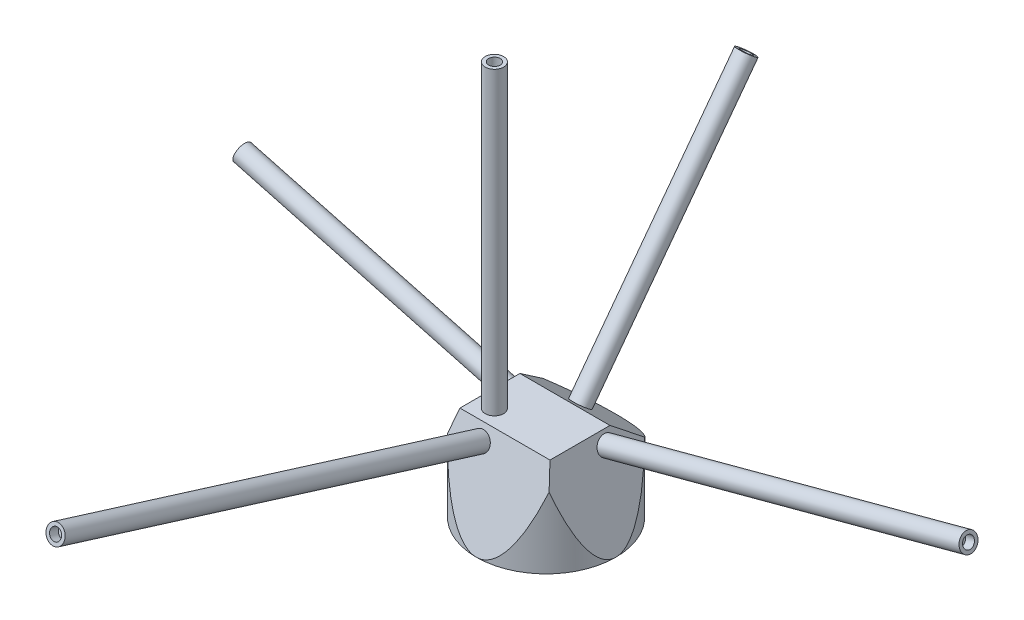
ISO-10303-21;
HEADER;
FILE_DESCRIPTION(('STEP AP214'),'2;1');
FILE_NAME('part.step','',(''),(''),'','','');
FILE_SCHEMA(('AUTOMOTIVE_DESIGN { 1 0 10303 214 1 1 1 1 }'));
ENDSEC;
DATA;
#1=APPLICATION_CONTEXT('core data for automotive mechanical design processes');
#2=APPLICATION_PROTOCOL_DEFINITION('international standard','automotive_design',2000,#1);
#3=PRODUCT_CONTEXT('',#1,'mechanical');
#4=PRODUCT('Part','Part','',(#3));
#5=PRODUCT_RELATED_PRODUCT_CATEGORY('part','',(#4));
#6=PRODUCT_DEFINITION_FORMATION('','',#4);
#7=PRODUCT_DEFINITION_CONTEXT('part definition',#1,'design');
#8=PRODUCT_DEFINITION('design','',#6,#7);
#9=PRODUCT_DEFINITION_SHAPE('','',#8);
#10=(LENGTH_UNIT() NAMED_UNIT(*) SI_UNIT(.MILLI.,.METRE.));
#11=(NAMED_UNIT(*) PLANE_ANGLE_UNIT() SI_UNIT($,.RADIAN.));
#12=(NAMED_UNIT(*) SI_UNIT($,.STERADIAN.) SOLID_ANGLE_UNIT());
#13=UNCERTAINTY_MEASURE_WITH_UNIT(LENGTH_MEASURE(1.E-05),#10,'distance_accuracy_value','');
#14=(GEOMETRIC_REPRESENTATION_CONTEXT(3) GLOBAL_UNCERTAINTY_ASSIGNED_CONTEXT((#13)) GLOBAL_UNIT_ASSIGNED_CONTEXT((#10,
#11,#12)) REPRESENTATION_CONTEXT('',''));
#15=CARTESIAN_POINT('',(0.,0.,0.));
#16=DIRECTION('',(0.,0.,1.));
#17=DIRECTION('',(1.,0.,0.));
#18=AXIS2_PLACEMENT_3D('',#15,#16,#17);
#19=CARTESIAN_POINT('',(-15.115,0.,-4.0745738296475));
#20=DIRECTION('',(0.,-0.800715242095726,0.599045157793286));
#21=DIRECTION('',(0.,-0.599045157793286,-0.800715242095726));
#22=AXIS2_PLACEMENT_3D('',#19,#20,#21);
#23=PLANE('',#22);
#24=CARTESIAN_POINT('',(0.,3.04834177545201,0.));
#25=DIRECTION('',(0.,-0.800715242095726,0.599045157793286));
#26=DIRECTION('',(0.,0.599045157793286,0.800715242095726));
#27=AXIS2_PLACEMENT_3D('',#24,#25,#26);
#28=ELLIPSE('',#27,18.8768730821699,15.115);
#29=CARTESIAN_POINT('',(11.010470804893,-4.69886600146518,-10.3553250868622));
#30=VERTEX_POINT('',#29);
#31=CARTESIAN_POINT('',(-11.010470804893,-4.69886600146518,-10.3553250868622));
#32=VERTEX_POINT('',#31);
#33=EDGE_CURVE('E170',#30,#32,#28,.F.);
#34=ORIENTED_EDGE('',*,*,#33,.T.);
#35=DIRECTION('',(0.158658439582921,0.591457370299799,0.790573006538396));
#36=VECTOR('',#35,1.);
#37=CARTESIAN_POINT('',(-9.88505046491901,-0.503450009017749,-4.74751157166802));
#38=LINE('',#37,#36);
#39=CARTESIAN_POINT('',(-9.75,0.,-4.0745738296475));
#40=VERTEX_POINT('',#39);
#41=EDGE_CURVE('E121',#32,#40,#38,.T.);
#42=ORIENTED_EDGE('',*,*,#41,.T.);
#43=DIRECTION('',(1.,0.,0.));
#44=VECTOR('',#43,1.);
#45=CARTESIAN_POINT('',(0.,0.,-4.0745738296475));
#46=LINE('',#45,#44);
#47=CARTESIAN_POINT('',(9.75,0.,-4.0745738296475));
#48=VERTEX_POINT('',#47);
#49=EDGE_CURVE('E101',#40,#48,#46,.T.);
#50=ORIENTED_EDGE('',*,*,#49,.T.);
#51=DIRECTION('',(0.158658439582921,-0.591457370299799,-0.790573006538396));
#52=VECTOR('',#51,1.);
#53=CARTESIAN_POINT('',(9.12408577628868,2.33332422632364,-0.955730035548645));
#54=LINE('',#53,#52);
#55=EDGE_CURVE('E112',#48,#30,#54,.T.);
#56=ORIENTED_EDGE('',*,*,#55,.T.);
#57=EDGE_LOOP('',(#34,#42,#50,#56));
#58=FACE_BOUND('',#57,.T.);
#59=CARTESIAN_POINT('',(0.,-2.50315939646312,-7.42042823823084));
#60=DIRECTION('',(0.,-0.800715242095726,0.599045157793286));
#61=DIRECTION('',(0.,-0.599045157793286,-0.800715242095726));
#62=AXIS2_PLACEMENT_3D('',#59,#60,#61);
#63=CIRCLE('',#62,1.99);
#64=CARTESIAN_POINT('',(0.,-3.69525926047176,-9.01385157000134));
#65=VERTEX_POINT('',#64);
#66=EDGE_CURVE('E11',#65,#65,#63,.F.);
#67=ORIENTED_EDGE('',*,*,#66,.F.);
#68=EDGE_LOOP('',(#67));
#69=FACE_BOUND('',#68,.T.);
#70=ADVANCED_FACE('F34',(#58,#69),#23,.F.);
#71=CARTESIAN_POINT('',(-9.75,0.,-15.115));
#72=DIRECTION('',(0.965853154267715,-0.259090108632315,0.));
#73=DIRECTION('',(0.259090108632315,0.965853154267715,0.));
#74=AXIS2_PLACEMENT_3D('',#71,#72,#73);
#75=PLANE('',#74);
#76=DIRECTION('',(0.,0.,1.));
#77=VECTOR('',#76,1.);
#78=CARTESIAN_POINT('',(-9.75,0.,-15.115));
#79=LINE('',#78,#77);
#80=CARTESIAN_POINT('',(-9.75,0.,8.90542660333367));
#81=VERTEX_POINT('',#80);
#82=EDGE_CURVE('E49',#40,#81,#79,.T.);
#83=ORIENTED_EDGE('',*,*,#82,.F.);
#84=ORIENTED_EDGE('',*,*,#41,.F.);
#85=CARTESIAN_POINT('',(0.,36.3466915191053,0.));
#86=DIRECTION('',(0.965853154267715,-0.259090108632315,0.));
#87=DIRECTION('',(0.259090108632315,0.965853154267715,0.));
#88=AXIS2_PLACEMENT_3D('',#85,#86,#87);
#89=ELLIPSE('',#88,58.3387767282552,15.115);
#90=CARTESIAN_POINT('',(-15.115,-20.,0.));
#91=VERTEX_POINT('',#90);
#92=EDGE_CURVE('E102',#32,#91,#89,.F.);
#93=ORIENTED_EDGE('',*,*,#92,.T.);
#94=CARTESIAN_POINT('',(-11.0064176168281,-4.68375626030972,10.3596330168581));
#95=VERTEX_POINT('',#94);
#96=EDGE_CURVE('E87',#91,#95,#89,.F.);
#97=ORIENTED_EDGE('',*,*,#96,.T.);
#98=DIRECTION('',(-0.248171729597381,-0.925150902506545,0.287239621605324));
#99=VECTOR('',#98,1.);
#100=CARTESIAN_POINT('',(-10.0804260975473,-1.23178414742711,9.2878693069486));
#101=LINE('',#100,#99);
#102=EDGE_CURVE('E83',#81,#95,#101,.T.);
#103=ORIENTED_EDGE('',*,*,#102,.F.);
#104=EDGE_LOOP('',(#83,#84,#93,#97,#103));
#105=FACE_BOUND('',#104,.T.);
#106=CARTESIAN_POINT('',(-10.4619538442376,-2.65406838485589,-2.6311460596475));
#107=DIRECTION('',(0.965853154267715,-0.259090108632315,0.));
#108=DIRECTION('',(0.259090108632315,0.965853154267715,0.));
#109=AXIS2_PLACEMENT_3D('',#106,#107,#108);
#110=CIRCLE('',#109,1.99);
#111=CARTESIAN_POINT('',(-9.94636452805929,-0.73202060786314,-2.6311460596475));
#112=VERTEX_POINT('',#111);
#113=EDGE_CURVE('E42',#112,#112,#110,.F.);
#114=ORIENTED_EDGE('',*,*,#113,.F.);
#115=EDGE_LOOP('',(#114));
#116=FACE_BOUND('',#115,.T.);
#117=ADVANCED_FACE('F84',(#105,#116),#75,.F.);
#118=CARTESIAN_POINT('',(9.75,0.,-15.115));
#119=DIRECTION('',(-0.965853154267715,-0.259090108632315,0.));
#120=DIRECTION('',(0.259090108632315,-0.965853154267715,0.));
#121=AXIS2_PLACEMENT_3D('',#118,#119,#120);
#122=PLANE('',#121);
#123=CARTESIAN_POINT('',(0.,36.3466915191053,0.));
#124=DIRECTION('',(-0.965853154267715,-0.259090108632315,0.));
#125=DIRECTION('',(-0.259090108632315,0.965853154267715,0.));
#126=AXIS2_PLACEMENT_3D('',#123,#124,#125);
#127=ELLIPSE('',#126,58.3387767282552,15.115);
#128=CARTESIAN_POINT('',(11.0064176168281,-4.68375626030972,10.3596330168581));
#129=VERTEX_POINT('',#128);
#130=CARTESIAN_POINT('',(15.115,-20.,0.));
#131=VERTEX_POINT('',#130);
#132=EDGE_CURVE('E177',#129,#131,#127,.F.);
#133=ORIENTED_EDGE('',*,*,#132,.T.);
#134=EDGE_CURVE('E57',#131,#30,#127,.F.);
#135=ORIENTED_EDGE('',*,*,#134,.T.);
#136=ORIENTED_EDGE('',*,*,#55,.F.);
#137=DIRECTION('',(0.,0.,1.));
#138=VECTOR('',#137,1.);
#139=CARTESIAN_POINT('',(9.75,0.,-15.115));
#140=LINE('',#139,#138);
#141=CARTESIAN_POINT('',(9.75,0.,8.90542660333367));
#142=VERTEX_POINT('',#141);
#143=EDGE_CURVE('E92',#48,#142,#140,.T.);
#144=ORIENTED_EDGE('',*,*,#143,.T.);
#145=DIRECTION('',(-0.248171729597381,0.925150902506545,-0.287239621605324));
#146=VECTOR('',#145,1.);
#147=CARTESIAN_POINT('',(8.21858435871124,5.70891198989283,7.13293120251627));
#148=LINE('',#147,#146);
#149=EDGE_CURVE('E109',#129,#142,#148,.T.);
#150=ORIENTED_EDGE('',*,*,#149,.F.);
#151=EDGE_LOOP('',(#133,#135,#136,#144,#150));
#152=FACE_BOUND('',#151,.T.);
#153=CARTESIAN_POINT('',(10.4619538436317,-2.6540683825972,-2.63114605808901));
#154=DIRECTION('',(-0.965853154267715,-0.259090108632315,0.));
#155=DIRECTION('',(0.259090108632315,-0.965853154267715,0.));
#156=AXIS2_PLACEMENT_3D('',#153,#154,#155);
#157=CIRCLE('',#156,1.99);
#158=CARTESIAN_POINT('',(10.97754315981,-4.57611615958995,-2.63114605808901));
#159=VERTEX_POINT('',#158);
#160=EDGE_CURVE('E126',#159,#159,#157,.F.);
#161=ORIENTED_EDGE('',*,*,#160,.F.);
#162=EDGE_LOOP('',(#161));
#163=FACE_BOUND('',#162,.T.);
#164=ADVANCED_FACE('F133',(#152,#163),#122,.F.);
#165=CARTESIAN_POINT('',(-15.115,0.,8.90542660333367));
#166=DIRECTION('',(0.,-0.296515806173068,-0.955027945501877));
#167=DIRECTION('',(0.,0.955027945501877,-0.296515806173068));
#168=AXIS2_PLACEMENT_3D('',#165,#166,#167);
#169=PLANE('',#168);
#170=DIRECTION('',(-1.,0.,0.));
#171=VECTOR('',#170,1.);
#172=CARTESIAN_POINT('',(0.,0.,8.90542660333367));
#173=LINE('',#172,#171);
#174=EDGE_CURVE('E100',#142,#81,#173,.T.);
#175=ORIENTED_EDGE('',*,*,#174,.T.);
#176=ORIENTED_EDGE('',*,*,#102,.T.);
#177=CARTESIAN_POINT('',(0.,28.6828934435806,0.));
#178=DIRECTION('',(0.,-0.296515806173068,-0.955027945501877));
#179=DIRECTION('',(0.,0.955027945501877,-0.296515806173068));
#180=AXIS2_PLACEMENT_3D('',#177,#178,#179);
#181=ELLIPSE('',#180,50.9753601168155,15.115);
#182=CARTESIAN_POINT('',(0.,-20.,15.115));
#183=VERTEX_POINT('',#182);
#184=EDGE_CURVE('E176',#95,#183,#181,.F.);
#185=ORIENTED_EDGE('',*,*,#184,.T.);
#186=EDGE_CURVE('E174',#183,#129,#181,.F.);
#187=ORIENTED_EDGE('',*,*,#186,.T.);
#188=ORIENTED_EDGE('',*,*,#149,.T.);
#189=EDGE_LOOP('',(#175,#176,#185,#187,#188));
#190=FACE_BOUND('',#189,.T.);
#191=CARTESIAN_POINT('',(-4.31288421413001,-3.01911248705977,9.84279663239314));
#192=DIRECTION('',(0.,-0.296515806173068,-0.955027945501877));
#193=DIRECTION('',(0.,0.955027945501877,-0.296515806173068));
#194=AXIS2_PLACEMENT_3D('',#191,#192,#193);
#195=CIRCLE('',#194,1.99);
#196=CARTESIAN_POINT('',(-4.31288421413001,-1.11860687551103,9.25273017810873));
#197=VERTEX_POINT('',#196);
#198=EDGE_CURVE('E123',#197,#197,#195,.F.);
#199=ORIENTED_EDGE('',*,*,#198,.F.);
#200=EDGE_LOOP('',(#199));
#201=FACE_BOUND('',#200,.T.);
#202=ADVANCED_FACE('F106',(#190,#201),#169,.F.);
#203=CARTESIAN_POINT('',(0.,0.,0.));
#204=DIRECTION('',(0.,1.,0.));
#205=DIRECTION('',(0.,0.,1.));
#206=AXIS2_PLACEMENT_3D('',#203,#204,#205);
#207=PLANE('',#206);
#208=ORIENTED_EDGE('',*,*,#82,.T.);
#209=ORIENTED_EDGE('',*,*,#174,.F.);
#210=ORIENTED_EDGE('',*,*,#143,.F.);
#211=ORIENTED_EDGE('',*,*,#49,.F.);
#212=EDGE_LOOP('',(#208,#209,#210,#211));
#213=FACE_BOUND('',#212,.T.);
#214=CARTESIAN_POINT('',(-5.95399221406699,0.,5.2387399026368));
#215=DIRECTION('',(0.,1.,0.));
#216=DIRECTION('',(0.,0.,1.));
#217=AXIS2_PLACEMENT_3D('',#214,#215,#216);
#218=CIRCLE('',#217,1.99);
#219=CARTESIAN_POINT('',(-5.95399221406699,0.,7.2287399026368));
#220=VERTEX_POINT('',#219);
#221=EDGE_CURVE('E182',#220,#220,#218,.T.);
#222=ORIENTED_EDGE('',*,*,#221,.F.);
#223=EDGE_LOOP('',(#222));
#224=FACE_BOUND('',#223,.T.);
#225=ADVANCED_FACE('F97',(#213,#224),#207,.T.);
#226=CARTESIAN_POINT('',(0.,-20.,0.));
#227=DIRECTION('',(0.,1.,0.));
#228=DIRECTION('',(0.,0.,1.));
#229=AXIS2_PLACEMENT_3D('',#226,#227,#228);
#230=CYLINDRICAL_SURFACE('',#229,15.115);
#231=ORIENTED_EDGE('',*,*,#96,.F.);
#232=CARTESIAN_POINT('',(0.,-20.,0.));
#233=DIRECTION('',(0.,1.,0.));
#234=DIRECTION('',(0.,0.,1.));
#235=AXIS2_PLACEMENT_3D('',#232,#233,#234);
#236=CIRCLE('',#235,15.115);
#237=EDGE_CURVE('E117',#91,#183,#236,.T.);
#238=ORIENTED_EDGE('',*,*,#237,.T.);
#239=ORIENTED_EDGE('',*,*,#184,.F.);
#240=EDGE_LOOP('',(#231,#238,#239));
#241=FACE_BOUND('',#240,.T.);
#242=ADVANCED_FACE('F152',(#241),#230,.T.);
#243=ORIENTED_EDGE('',*,*,#132,.F.);
#244=ORIENTED_EDGE('',*,*,#186,.F.);
#245=EDGE_CURVE('E110',#183,#131,#236,.T.);
#246=ORIENTED_EDGE('',*,*,#245,.T.);
#247=EDGE_LOOP('',(#243,#244,#246));
#248=FACE_BOUND('',#247,.T.);
#249=ADVANCED_FACE('F156',(#248),#230,.T.);
#250=ORIENTED_EDGE('',*,*,#92,.F.);
#251=ORIENTED_EDGE('',*,*,#33,.F.);
#252=ORIENTED_EDGE('',*,*,#134,.F.);
#253=EDGE_CURVE('E115',#131,#91,#236,.T.);
#254=ORIENTED_EDGE('',*,*,#253,.T.);
#255=EDGE_LOOP('',(#250,#251,#252,#254));
#256=FACE_BOUND('',#255,.T.);
#257=ADVANCED_FACE('F36',(#256),#230,.T.);
#258=CARTESIAN_POINT('',(0.,-20.,0.));
#259=DIRECTION('',(0.,1.,0.));
#260=DIRECTION('',(0.,0.,1.));
#261=AXIS2_PLACEMENT_3D('',#258,#259,#260);
#262=PLANE('',#261);
#263=ORIENTED_EDGE('',*,*,#245,.F.);
#264=ORIENTED_EDGE('',*,*,#237,.F.);
#265=ORIENTED_EDGE('',*,*,#253,.F.);
#266=EDGE_LOOP('',(#263,#264,#265));
#267=FACE_BOUND('',#266,.T.);
#268=ADVANCED_FACE('F148',(#267),#262,.F.);
#269=CARTESIAN_POINT('',(-5.95399221406699,65.,5.2387399026368));
#270=DIRECTION('',(0.,-1.,0.));
#271=DIRECTION('',(0.,0.,-1.));
#272=AXIS2_PLACEMENT_3D('',#269,#270,#271);
#273=CYLINDRICAL_SURFACE('',#272,1.99);
#274=CARTESIAN_POINT('',(-5.95399221406699,65.,5.2387399026368));
#275=DIRECTION('',(0.,1.,0.));
#276=DIRECTION('',(0.,0.,1.));
#277=AXIS2_PLACEMENT_3D('',#274,#275,#276);
#278=CIRCLE('',#277,1.99);
#279=CARTESIAN_POINT('',(-5.95399221406699,65.,7.2287399026368));
#280=VERTEX_POINT('',#279);
#281=EDGE_CURVE('E103',#280,#280,#278,.T.);
#282=ORIENTED_EDGE('',*,*,#281,.F.);
#283=EDGE_LOOP('',(#282));
#284=FACE_BOUND('',#283,.T.);
#285=ORIENTED_EDGE('',*,*,#221,.T.);
#286=EDGE_LOOP('',(#285));
#287=FACE_BOUND('',#286,.T.);
#288=ADVANCED_FACE('F143',(#284,#287),#273,.T.);
#289=CARTESIAN_POINT('',(-5.95399221406699,65.,5.2387399026368));
#290=DIRECTION('',(0.,1.,0.));
#291=DIRECTION('',(0.,0.,1.));
#292=AXIS2_PLACEMENT_3D('',#289,#290,#291);
#293=PLANE('',#292);
#294=CARTESIAN_POINT('',(-5.95399221406699,65.,5.2387399026368));
#295=DIRECTION('',(0.,1.,0.));
#296=DIRECTION('',(0.,0.,1.));
#297=AXIS2_PLACEMENT_3D('',#294,#295,#296);
#298=CIRCLE('',#297,1.25);
#299=CARTESIAN_POINT('',(-5.95399221406699,65.,6.4887399026368));
#300=VERTEX_POINT('',#299);
#301=EDGE_CURVE('E188',#300,#300,#298,.T.);
#302=ORIENTED_EDGE('',*,*,#301,.F.);
#303=EDGE_LOOP('',(#302));
#304=FACE_BOUND('',#303,.T.);
#305=ORIENTED_EDGE('',*,*,#281,.T.);
#306=EDGE_LOOP('',(#305));
#307=FACE_BOUND('',#306,.T.);
#308=ADVANCED_FACE('F305',(#304,#307),#293,.T.);
#309=CARTESIAN_POINT('',(-5.95399221406699,63.,5.2387399026368));
#310=DIRECTION('',(0.,1.,0.));
#311=DIRECTION('',(0.,0.,1.));
#312=AXIS2_PLACEMENT_3D('',#309,#310,#311);
#313=CYLINDRICAL_SURFACE('',#312,1.25);
#314=CARTESIAN_POINT('',(-5.95399221406699,63.,5.2387399026368));
#315=DIRECTION('',(0.,1.,0.));
#316=DIRECTION('',(0.,0.,1.));
#317=AXIS2_PLACEMENT_3D('',#314,#315,#316);
#318=CIRCLE('',#317,1.25);
#319=CARTESIAN_POINT('',(-5.95399221406699,63.,6.4887399026368));
#320=VERTEX_POINT('',#319);
#321=EDGE_CURVE('E185',#320,#320,#318,.T.);
#322=ORIENTED_EDGE('',*,*,#321,.F.);
#323=EDGE_LOOP('',(#322));
#324=FACE_BOUND('',#323,.T.);
#325=ORIENTED_EDGE('',*,*,#301,.T.);
#326=EDGE_LOOP('',(#325));
#327=FACE_BOUND('',#326,.T.);
#328=ADVANCED_FACE('F302',(#324,#327),#313,.F.);
#329=CARTESIAN_POINT('',(-5.95399221406699,63.,5.2387399026368));
#330=DIRECTION('',(0.,1.,0.));
#331=DIRECTION('',(0.,0.,1.));
#332=AXIS2_PLACEMENT_3D('',#329,#330,#331);
#333=PLANE('',#332);
#334=ORIENTED_EDGE('',*,*,#321,.T.);
#335=EDGE_LOOP('',(#334));
#336=FACE_BOUND('',#335,.T.);
#337=ADVANCED_FACE('F298',(#336),#333,.T.);
#338=CARTESIAN_POINT('',(-4.31288421413001,25.565011228024,101.907490578774));
#339=DIRECTION('',(0.,-0.296515806173068,-0.955027945501877));
#340=DIRECTION('',(0.,0.955027945501877,-0.296515806173068));
#341=AXIS2_PLACEMENT_3D('',#338,#339,#340);
#342=CYLINDRICAL_SURFACE('',#341,1.99);
#343=CARTESIAN_POINT('',(-4.31288421413001,25.565011228024,101.907490578774));
#344=DIRECTION('',(0.,0.296515806173068,0.955027945501877));
#345=DIRECTION('',(0.,-0.955027945501877,0.296515806173068));
#346=AXIS2_PLACEMENT_3D('',#343,#344,#345);
#347=CIRCLE('',#346,1.99);
#348=CARTESIAN_POINT('',(-4.31288421413001,23.6645056164753,102.497557033058));
#349=VERTEX_POINT('',#348);
#350=EDGE_CURVE('E191',#349,#349,#347,.T.);
#351=ORIENTED_EDGE('',*,*,#350,.F.);
#352=EDGE_LOOP('',(#351));
#353=FACE_BOUND('',#352,.T.);
#354=ORIENTED_EDGE('',*,*,#198,.T.);
#355=EDGE_LOOP('',(#354));
#356=FACE_BOUND('',#355,.T.);
#357=ADVANCED_FACE('F294',(#353,#356),#342,.T.);
#358=CARTESIAN_POINT('',(-4.31288421413001,25.565011228024,101.907490578774));
#359=DIRECTION('',(0.,0.296515806173068,0.955027945501877));
#360=DIRECTION('',(0.,-0.955027945501877,0.296515806173068));
#361=AXIS2_PLACEMENT_3D('',#358,#359,#360);
#362=PLANE('',#361);
#363=CARTESIAN_POINT('',(-4.31288421413001,25.565011228024,101.907490578774));
#364=DIRECTION('',(0.,0.296515806173068,0.955027945501877));
#365=DIRECTION('',(0.,-0.955027945501877,0.296515806173068));
#366=AXIS2_PLACEMENT_3D('',#363,#364,#365);
#367=CIRCLE('',#366,1.25);
#368=CARTESIAN_POINT('',(-4.31288421413001,24.3712262961467,102.27813533649));
#369=VERTEX_POINT('',#368);
#370=EDGE_CURVE('E197',#369,#369,#367,.T.);
#371=ORIENTED_EDGE('',*,*,#370,.F.);
#372=EDGE_LOOP('',(#371));
#373=FACE_BOUND('',#372,.T.);
#374=ORIENTED_EDGE('',*,*,#350,.T.);
#375=EDGE_LOOP('',(#374));
#376=FACE_BOUND('',#375,.T.);
#377=ADVANCED_FACE('F290',(#373,#376),#362,.T.);
#378=CARTESIAN_POINT('',(-4.31288421413001,24.9719796156779,99.9974346877704));
#379=DIRECTION('',(0.,0.296515806173068,0.955027945501877));
#380=DIRECTION('',(0.,-0.955027945501877,0.296515806173068));
#381=AXIS2_PLACEMENT_3D('',#378,#379,#380);
#382=CYLINDRICAL_SURFACE('',#381,1.25);
#383=CARTESIAN_POINT('',(-4.31288421413001,24.9719796156779,99.9974346877704));
#384=DIRECTION('',(0.,0.296515806173068,0.955027945501877));
#385=DIRECTION('',(0.,-0.955027945501877,0.296515806173068));
#386=AXIS2_PLACEMENT_3D('',#383,#384,#385);
#387=CIRCLE('',#386,1.25);
#388=CARTESIAN_POINT('',(-4.31288421413001,23.7781946838005,100.368079445487));
#389=VERTEX_POINT('',#388);
#390=EDGE_CURVE('E196',#389,#389,#387,.T.);
#391=ORIENTED_EDGE('',*,*,#390,.F.);
#392=EDGE_LOOP('',(#391));
#393=FACE_BOUND('',#392,.T.);
#394=ORIENTED_EDGE('',*,*,#370,.T.);
#395=EDGE_LOOP('',(#394));
#396=FACE_BOUND('',#395,.T.);
#397=ADVANCED_FACE('F286',(#393,#396),#382,.F.);
#398=CARTESIAN_POINT('',(-4.31288421413001,24.9719796156779,99.9974346877704));
#399=DIRECTION('',(0.,0.296515806173068,0.955027945501877));
#400=DIRECTION('',(0.,-0.955027945501877,0.296515806173068));
#401=AXIS2_PLACEMENT_3D('',#398,#399,#400);
#402=PLANE('',#401);
#403=ORIENTED_EDGE('',*,*,#390,.T.);
#404=EDGE_LOOP('',(#403));
#405=FACE_BOUND('',#404,.T.);
#406=ADVANCED_FACE('F282',(#405),#402,.T.);
#407=CARTESIAN_POINT('',(88.8409373124568,18.3710939329151,-2.63114605808901));
#408=DIRECTION('',(-0.965853154267716,-0.259090108632315,0.));
#409=DIRECTION('',(0.259090108632315,-0.965853154267716,0.));
#410=AXIS2_PLACEMENT_3D('',#407,#408,#409);
#411=CYLINDRICAL_SURFACE('',#410,1.99);
#412=CARTESIAN_POINT('',(88.8409373124568,18.3710939329151,-2.63114605808901));
#413=DIRECTION('',(0.965853154267716,0.259090108632315,0.));
#414=DIRECTION('',(-0.259090108632315,0.965853154267716,0.));
#415=AXIS2_PLACEMENT_3D('',#412,#413,#414);
#416=CIRCLE('',#415,1.99);
#417=CARTESIAN_POINT('',(88.3253479962785,20.2931417099079,-2.63114605808901));
#418=VERTEX_POINT('',#417);
#419=EDGE_CURVE('E200',#418,#418,#416,.T.);
#420=ORIENTED_EDGE('',*,*,#419,.F.);
#421=EDGE_LOOP('',(#420));
#422=FACE_BOUND('',#421,.T.);
#423=ORIENTED_EDGE('',*,*,#160,.T.);
#424=EDGE_LOOP('',(#423));
#425=FACE_BOUND('',#424,.T.);
#426=ADVANCED_FACE('F278',(#422,#425),#411,.T.);
#427=CARTESIAN_POINT('',(88.8409373124568,18.3710939329151,-2.63114605808901));
#428=DIRECTION('',(0.965853154267716,0.259090108632315,0.));
#429=DIRECTION('',(-0.259090108632315,0.965853154267716,0.));
#430=AXIS2_PLACEMENT_3D('',#427,#428,#429);
#431=PLANE('',#430);
#432=CARTESIAN_POINT('',(88.8409373124568,18.3710939329151,-2.63114605808901));
#433=DIRECTION('',(0.965853154267716,0.259090108632315,0.));
#434=DIRECTION('',(-0.259090108632315,0.965853154267716,0.));
#435=AXIS2_PLACEMENT_3D('',#432,#433,#434);
#436=CIRCLE('',#435,1.25);
#437=CARTESIAN_POINT('',(88.5170746766664,19.5784103757498,-2.63114605808901));
#438=VERTEX_POINT('',#437);
#439=EDGE_CURVE('E206',#438,#438,#436,.T.);
#440=ORIENTED_EDGE('',*,*,#439,.F.);
#441=EDGE_LOOP('',(#440));
#442=FACE_BOUND('',#441,.T.);
#443=ORIENTED_EDGE('',*,*,#419,.T.);
#444=EDGE_LOOP('',(#443));
#445=FACE_BOUND('',#444,.T.);
#446=ADVANCED_FACE('F274',(#442,#445),#431,.T.);
#447=CARTESIAN_POINT('',(86.9092310039214,17.8529137156505,-2.63114605808901));
#448=DIRECTION('',(0.965853154267715,0.259090108632315,0.));
#449=DIRECTION('',(-0.259090108632315,0.965853154267716,0.));
#450=AXIS2_PLACEMENT_3D('',#447,#448,#449);
#451=CYLINDRICAL_SURFACE('',#450,1.25);
#452=CARTESIAN_POINT('',(86.9092310039214,17.8529137156505,-2.63114605808901));
#453=DIRECTION('',(0.965853154267716,0.259090108632315,0.));
#454=DIRECTION('',(-0.259090108632315,0.965853154267716,0.));
#455=AXIS2_PLACEMENT_3D('',#452,#453,#454);
#456=CIRCLE('',#455,1.25);
#457=CARTESIAN_POINT('',(86.585368368131,19.0602301584852,-2.63114605808901));
#458=VERTEX_POINT('',#457);
#459=EDGE_CURVE('E205',#458,#458,#456,.T.);
#460=ORIENTED_EDGE('',*,*,#459,.F.);
#461=EDGE_LOOP('',(#460));
#462=FACE_BOUND('',#461,.T.);
#463=ORIENTED_EDGE('',*,*,#439,.T.);
#464=EDGE_LOOP('',(#463));
#465=FACE_BOUND('',#464,.T.);
#466=ADVANCED_FACE('F270',(#462,#465),#451,.F.);
#467=CARTESIAN_POINT('',(86.9092310039214,17.8529137156505,-2.63114605808901));
#468=DIRECTION('',(0.965853154267716,0.259090108632315,0.));
#469=DIRECTION('',(-0.259090108632315,0.965853154267716,0.));
#470=AXIS2_PLACEMENT_3D('',#467,#468,#469);
#471=PLANE('',#470);
#472=ORIENTED_EDGE('',*,*,#459,.T.);
#473=EDGE_LOOP('',(#472));
#474=FACE_BOUND('',#473,.T.);
#475=ADVANCED_FACE('F266',(#474),#471,.T.);
#476=CARTESIAN_POINT('',(-68.4131431003005,12.891338133083,-2.6311460596475));
#477=DIRECTION('',(0.965853154267715,-0.259090108632315,0.));
#478=DIRECTION('',(0.259090108632315,0.965853154267715,0.));
#479=AXIS2_PLACEMENT_3D('',#476,#477,#478);
#480=CYLINDRICAL_SURFACE('',#479,1.99);
#481=CARTESIAN_POINT('',(-68.4131431003005,12.891338133083,-2.6311460596475));
#482=DIRECTION('',(-0.965853154267716,0.259090108632315,0.));
#483=DIRECTION('',(-0.259090108632315,-0.965853154267716,0.));
#484=AXIS2_PLACEMENT_3D('',#481,#482,#483);
#485=CIRCLE('',#484,1.99);
#486=CARTESIAN_POINT('',(-68.9287324164788,10.9692903560902,-2.6311460596475));
#487=VERTEX_POINT('',#486);
#488=EDGE_CURVE('E209',#487,#487,#485,.T.);
#489=ORIENTED_EDGE('',*,*,#488,.F.);
#490=EDGE_LOOP('',(#489));
#491=FACE_BOUND('',#490,.T.);
#492=ORIENTED_EDGE('',*,*,#113,.T.);
#493=EDGE_LOOP('',(#492));
#494=FACE_BOUND('',#493,.T.);
#495=ADVANCED_FACE('F131',(#491,#494),#480,.T.);
#496=CARTESIAN_POINT('',(-68.4131431003005,12.891338133083,-2.6311460596475));
#497=DIRECTION('',(-0.965853154267716,0.259090108632315,0.));
#498=DIRECTION('',(-0.259090108632315,-0.965853154267716,0.));
#499=AXIS2_PLACEMENT_3D('',#496,#497,#498);
#500=PLANE('',#499);
#501=CARTESIAN_POINT('',(-68.4131431003005,12.891338133083,-2.6311460596475));
#502=DIRECTION('',(-0.965853154267716,0.259090108632315,0.));
#503=DIRECTION('',(-0.259090108632315,-0.965853154267716,0.));
#504=AXIS2_PLACEMENT_3D('',#501,#502,#503);
#505=CIRCLE('',#504,1.25);
#506=CARTESIAN_POINT('',(-68.7370057360909,11.6840216902484,-2.6311460596475));
#507=VERTEX_POINT('',#506);
#508=EDGE_CURVE('E215',#507,#507,#505,.T.);
#509=ORIENTED_EDGE('',*,*,#508,.F.);
#510=EDGE_LOOP('',(#509));
#511=FACE_BOUND('',#510,.T.);
#512=ORIENTED_EDGE('',*,*,#488,.T.);
#513=EDGE_LOOP('',(#512));
#514=FACE_BOUND('',#513,.T.);
#515=ADVANCED_FACE('F259',(#511,#514),#500,.T.);
#516=CARTESIAN_POINT('',(-66.4814367917651,12.3731579158184,-2.6311460596475));
#517=DIRECTION('',(-0.965853154267715,0.259090108632315,0.));
#518=DIRECTION('',(-0.259090108632315,-0.965853154267716,0.));
#519=AXIS2_PLACEMENT_3D('',#516,#517,#518);
#520=CYLINDRICAL_SURFACE('',#519,1.25);
#521=CARTESIAN_POINT('',(-66.4814367917651,12.3731579158184,-2.6311460596475));
#522=DIRECTION('',(-0.965853154267716,0.259090108632315,0.));
#523=DIRECTION('',(-0.259090108632315,-0.965853154267716,0.));
#524=AXIS2_PLACEMENT_3D('',#521,#522,#523);
#525=CIRCLE('',#524,1.25);
#526=CARTESIAN_POINT('',(-66.8052994275555,11.1658414729837,-2.6311460596475));
#527=VERTEX_POINT('',#526);
#528=EDGE_CURVE('E214',#527,#527,#525,.T.);
#529=ORIENTED_EDGE('',*,*,#528,.F.);
#530=EDGE_LOOP('',(#529));
#531=FACE_BOUND('',#530,.T.);
#532=ORIENTED_EDGE('',*,*,#508,.T.);
#533=EDGE_LOOP('',(#532));
#534=FACE_BOUND('',#533,.T.);
#535=ADVANCED_FACE('F253',(#531,#534),#520,.F.);
#536=CARTESIAN_POINT('',(-66.4814367917651,12.3731579158184,-2.6311460596475));
#537=DIRECTION('',(-0.965853154267716,0.259090108632315,0.));
#538=DIRECTION('',(-0.259090108632315,-0.965853154267716,0.));
#539=AXIS2_PLACEMENT_3D('',#536,#537,#538);
#540=PLANE('',#539);
#541=ORIENTED_EDGE('',*,*,#528,.T.);
#542=EDGE_LOOP('',(#541));
#543=FACE_BOUND('',#542,.T.);
#544=ADVANCED_FACE('F247',(#543),#540,.T.);
#545=CARTESIAN_POINT('',(0.,45.5397551292805,-43.363137705828));
#546=DIRECTION('',(0.,-0.800715242095726,0.599045157793286));
#547=DIRECTION('',(0.,-0.599045157793286,-0.800715242095726));
#548=AXIS2_PLACEMENT_3D('',#545,#546,#547);
#549=CYLINDRICAL_SURFACE('',#548,1.99);
#550=CARTESIAN_POINT('',(0.,45.5397551292805,-43.363137705828));
#551=DIRECTION('',(0.,0.800715242095726,-0.599045157793286));
#552=DIRECTION('',(0.,0.599045157793286,0.800715242095726));
#553=AXIS2_PLACEMENT_3D('',#550,#551,#552);
#554=CIRCLE('',#553,1.99);
#555=CARTESIAN_POINT('',(0.,46.7318549932891,-41.7697143740575));
#556=VERTEX_POINT('',#555);
#557=EDGE_CURVE('E218',#556,#556,#554,.T.);
#558=ORIENTED_EDGE('',*,*,#557,.F.);
#559=EDGE_LOOP('',(#558));
#560=FACE_BOUND('',#559,.T.);
#561=ORIENTED_EDGE('',*,*,#66,.T.);
#562=EDGE_LOOP('',(#561));
#563=FACE_BOUND('',#562,.T.);
#564=ADVANCED_FACE('F241',(#560,#563),#549,.T.);
#565=CARTESIAN_POINT('',(0.,45.5397551292805,-43.363137705828));
#566=DIRECTION('',(0.,0.800715242095726,-0.599045157793286));
#567=DIRECTION('',(0.,0.599045157793286,0.800715242095726));
#568=AXIS2_PLACEMENT_3D('',#565,#566,#567);
#569=PLANE('',#568);
#570=CARTESIAN_POINT('',(0.,45.5397551292805,-43.363137705828));
#571=DIRECTION('',(0.,0.800715242095726,-0.599045157793286));
#572=DIRECTION('',(0.,0.599045157793286,0.800715242095726));
#573=AXIS2_PLACEMENT_3D('',#570,#571,#572);
#574=CIRCLE('',#573,1.25);
#575=CARTESIAN_POINT('',(0.,46.2885615765221,-42.3622436532083));
#576=VERTEX_POINT('',#575);
#577=EDGE_CURVE('E224',#576,#576,#574,.T.);
#578=ORIENTED_EDGE('',*,*,#577,.F.);
#579=EDGE_LOOP('',(#578));
#580=FACE_BOUND('',#579,.T.);
#581=ORIENTED_EDGE('',*,*,#557,.T.);
#582=EDGE_LOOP('',(#581));
#583=FACE_BOUND('',#582,.T.);
#584=ADVANCED_FACE('F235',(#580,#583),#569,.T.);
#585=CARTESIAN_POINT('',(0.,43.938324645089,-42.1650473902414));
#586=DIRECTION('',(0.,0.800715242095726,-0.599045157793286));
#587=DIRECTION('',(0.,0.599045157793286,0.800715242095726));
#588=AXIS2_PLACEMENT_3D('',#585,#586,#587);
#589=CYLINDRICAL_SURFACE('',#588,1.25);
#590=CARTESIAN_POINT('',(0.,43.938324645089,-42.1650473902414));
#591=DIRECTION('',(0.,0.800715242095726,-0.599045157793286));
#592=DIRECTION('',(0.,0.599045157793286,0.800715242095726));
#593=AXIS2_PLACEMENT_3D('',#590,#591,#592);
#594=CIRCLE('',#593,1.25);
#595=CARTESIAN_POINT('',(0.,44.6871310923306,-41.1641533376218));
#596=VERTEX_POINT('',#595);
#597=EDGE_CURVE('E223',#596,#596,#594,.T.);
#598=ORIENTED_EDGE('',*,*,#597,.F.);
#599=EDGE_LOOP('',(#598));
#600=FACE_BOUND('',#599,.T.);
#601=ORIENTED_EDGE('',*,*,#577,.T.);
#602=EDGE_LOOP('',(#601));
#603=FACE_BOUND('',#602,.T.);
#604=ADVANCED_FACE('F232',(#600,#603),#589,.F.);
#605=CARTESIAN_POINT('',(0.,43.938324645089,-42.1650473902414));
#606=DIRECTION('',(0.,0.800715242095726,-0.599045157793286));
#607=DIRECTION('',(0.,0.599045157793286,0.800715242095726));
#608=AXIS2_PLACEMENT_3D('',#605,#606,#607);
#609=PLANE('',#608);
#610=ORIENTED_EDGE('',*,*,#597,.T.);
#611=EDGE_LOOP('',(#610));
#612=FACE_BOUND('',#611,.T.);
#613=ADVANCED_FACE('F230',(#612),#609,.T.);
#614=CLOSED_SHELL('',(#70,#117,#164,#202,#225,#242,#249,#257,#268,#288,#308,#328,#337,#357,#377,
#397,#406,#426,#446,#466,#475,#495,#515,#535,#544,#564,#584,#604,#613));
#615=MANIFOLD_SOLID_BREP('B2',#614);
#616=ADVANCED_BREP_SHAPE_REPRESENTATION('',(#18,#615),#14);
#617=SHAPE_DEFINITION_REPRESENTATION(#9,#616);
ENDSEC;
END-ISO-10303-21;
